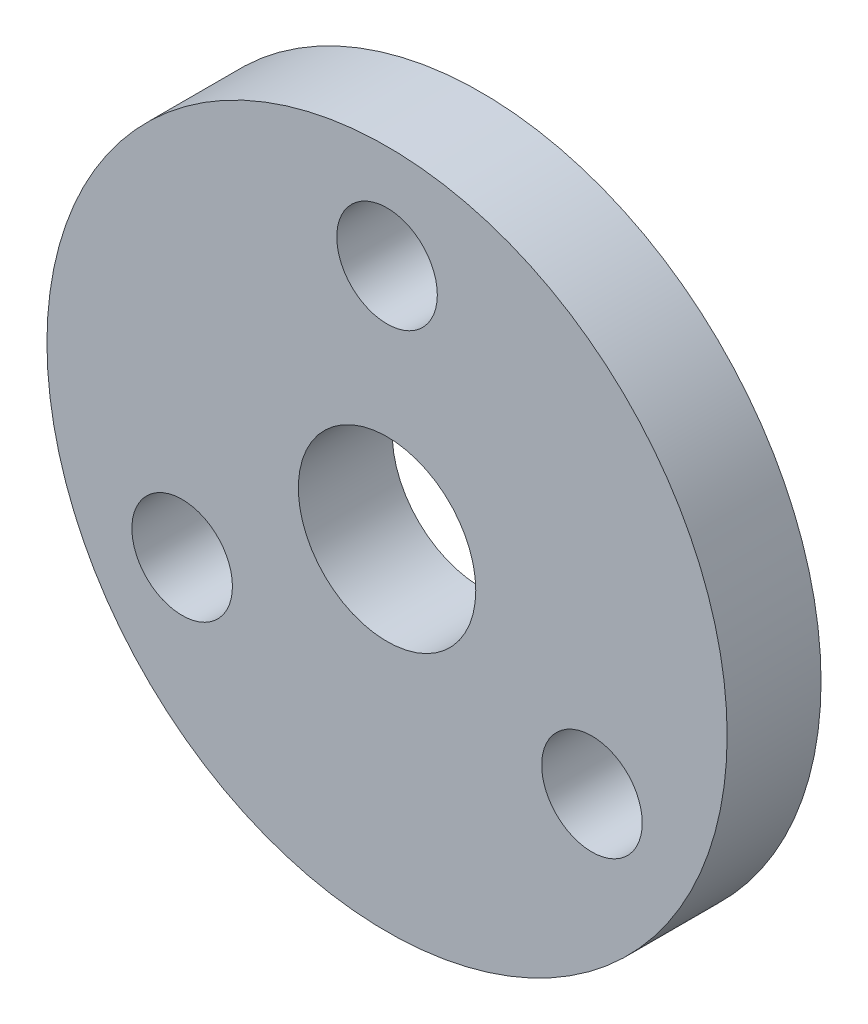
ISO-10303-21;
HEADER;
FILE_DESCRIPTION(('STEP AP214'),'2;1');
FILE_NAME('part.step','',(''),(''),'','','');
FILE_SCHEMA(('AUTOMOTIVE_DESIGN { 1 0 10303 214 1 1 1 1 }'));
ENDSEC;
DATA;
#1=APPLICATION_CONTEXT('core data for automotive mechanical design processes');
#2=APPLICATION_PROTOCOL_DEFINITION('international standard','automotive_design',2000,#1);
#3=PRODUCT_CONTEXT('',#1,'mechanical');
#4=PRODUCT('Part','Part','',(#3));
#5=PRODUCT_RELATED_PRODUCT_CATEGORY('part','',(#4));
#6=PRODUCT_DEFINITION_FORMATION('','',#4);
#7=PRODUCT_DEFINITION_CONTEXT('part definition',#1,'design');
#8=PRODUCT_DEFINITION('design','',#6,#7);
#9=PRODUCT_DEFINITION_SHAPE('','',#8);
#10=(LENGTH_UNIT() NAMED_UNIT(*) SI_UNIT(.MILLI.,.METRE.));
#11=(NAMED_UNIT(*) PLANE_ANGLE_UNIT() SI_UNIT($,.RADIAN.));
#12=(NAMED_UNIT(*) SI_UNIT($,.STERADIAN.) SOLID_ANGLE_UNIT());
#13=UNCERTAINTY_MEASURE_WITH_UNIT(LENGTH_MEASURE(1.E-05),#10,'distance_accuracy_value','');
#14=(GEOMETRIC_REPRESENTATION_CONTEXT(3) GLOBAL_UNCERTAINTY_ASSIGNED_CONTEXT((#13)) GLOBAL_UNIT_ASSIGNED_CONTEXT((#10,
#11,#12)) REPRESENTATION_CONTEXT('',''));
#15=CARTESIAN_POINT('',(0.,0.,0.));
#16=DIRECTION('',(0.,0.,1.));
#17=DIRECTION('',(1.,0.,0.));
#18=AXIS2_PLACEMENT_3D('',#15,#16,#17);
#19=CARTESIAN_POINT('',(10.1036297108185,-10.1100587120953,3.175));
#20=DIRECTION('',(0.,0.,1.));
#21=DIRECTION('',(1.,0.,0.));
#22=AXIS2_PLACEMENT_3D('',#19,#20,#21);
#23=PLANE('',#22);
#24=CARTESIAN_POINT('',(10.1036297108185,-2.11005871209532,3.175));
#25=DIRECTION('',(0.,0.,1.));
#26=DIRECTION('',(1.,0.,0.));
#27=AXIS2_PLACEMENT_3D('',#24,#25,#26);
#28=CIRCLE('',#27,1.7);
#29=CARTESIAN_POINT('',(11.8036297108185,-2.11005871209532,3.175));
#30=VERTEX_POINT('',#29);
#31=EDGE_CURVE('E52',#30,#30,#28,.T.);
#32=ORIENTED_EDGE('',*,*,#31,.F.);
#33=EDGE_LOOP('',(#32));
#34=FACE_BOUND('',#33,.T.);
#35=CARTESIAN_POINT('',(3.17542648054291,-14.1100587120953,3.175));
#36=DIRECTION('',(0.,0.,1.));
#37=DIRECTION('',(1.,0.,0.));
#38=AXIS2_PLACEMENT_3D('',#35,#36,#37);
#39=CIRCLE('',#38,1.7);
#40=CARTESIAN_POINT('',(4.87542648054291,-14.1100587120953,3.175));
#41=VERTEX_POINT('',#40);
#42=EDGE_CURVE('E41',#41,#41,#39,.T.);
#43=ORIENTED_EDGE('',*,*,#42,.F.);
#44=EDGE_LOOP('',(#43));
#45=FACE_BOUND('',#44,.T.);
#46=CARTESIAN_POINT('',(10.1036297108185,-10.1100587120953,3.175));
#47=DIRECTION('',(0.,0.,1.));
#48=DIRECTION('',(1.,0.,0.));
#49=AXIS2_PLACEMENT_3D('',#46,#47,#48);
#50=CIRCLE('',#49,11.5);
#51=CARTESIAN_POINT('',(21.6036297108185,-10.1100587120953,3.175));
#52=VERTEX_POINT('',#51);
#53=EDGE_CURVE('E10',#52,#52,#50,.T.);
#54=ORIENTED_EDGE('',*,*,#53,.T.);
#55=EDGE_LOOP('',(#54));
#56=FACE_BOUND('',#55,.T.);
#57=CARTESIAN_POINT('',(17.0318329410939,-14.1100587120954,3.175));
#58=DIRECTION('',(0.,0.,1.));
#59=DIRECTION('',(1.,0.,0.));
#60=AXIS2_PLACEMENT_3D('',#57,#58,#59);
#61=CIRCLE('',#60,1.7);
#62=CARTESIAN_POINT('',(18.7318329410939,-14.1100587120954,3.175));
#63=VERTEX_POINT('',#62);
#64=EDGE_CURVE('E46',#63,#63,#61,.T.);
#65=ORIENTED_EDGE('',*,*,#64,.F.);
#66=EDGE_LOOP('',(#65));
#67=FACE_BOUND('',#66,.T.);
#68=CARTESIAN_POINT('',(10.1036297108185,-10.1100587120953,3.175));
#69=DIRECTION('',(0.,0.,1.));
#70=DIRECTION('',(1.,0.,0.));
#71=AXIS2_PLACEMENT_3D('',#68,#69,#70);
#72=CIRCLE('',#71,3.);
#73=CARTESIAN_POINT('',(13.1036297108185,-10.1100587120953,3.175));
#74=VERTEX_POINT('',#73);
#75=EDGE_CURVE('E58',#74,#74,#72,.T.);
#76=ORIENTED_EDGE('',*,*,#75,.F.);
#77=EDGE_LOOP('',(#76));
#78=FACE_BOUND('',#77,.T.);
#79=ADVANCED_FACE('F30',(#34,#45,#56,#67,#78),#23,.T.);
#80=CARTESIAN_POINT('',(10.1036297108185,-10.1100587120953,0.));
#81=DIRECTION('',(0.,0.,1.));
#82=DIRECTION('',(1.,0.,0.));
#83=AXIS2_PLACEMENT_3D('',#80,#81,#82);
#84=PLANE('',#83);
#85=CARTESIAN_POINT('',(10.1036297108185,-10.1100587120953,0.));
#86=DIRECTION('',(0.,0.,1.));
#87=DIRECTION('',(1.,0.,0.));
#88=AXIS2_PLACEMENT_3D('',#85,#86,#87);
#89=CIRCLE('',#88,11.5);
#90=CARTESIAN_POINT('',(21.6036297108185,-10.1100587120953,0.));
#91=VERTEX_POINT('',#90);
#92=EDGE_CURVE('E34',#91,#91,#89,.T.);
#93=ORIENTED_EDGE('',*,*,#92,.F.);
#94=EDGE_LOOP('',(#93));
#95=FACE_BOUND('',#94,.T.);
#96=CARTESIAN_POINT('',(3.17542648054291,-14.1100587120953,0.));
#97=DIRECTION('',(0.,0.,1.));
#98=DIRECTION('',(1.,0.,0.));
#99=AXIS2_PLACEMENT_3D('',#96,#97,#98);
#100=CIRCLE('',#99,1.7);
#101=CARTESIAN_POINT('',(4.87542648054291,-14.1100587120953,0.));
#102=VERTEX_POINT('',#101);
#103=EDGE_CURVE('E43',#102,#102,#100,.T.);
#104=ORIENTED_EDGE('',*,*,#103,.T.);
#105=EDGE_LOOP('',(#104));
#106=FACE_BOUND('',#105,.T.);
#107=CARTESIAN_POINT('',(17.0318329410939,-14.1100587120954,0.));
#108=DIRECTION('',(0.,0.,1.));
#109=DIRECTION('',(1.,0.,0.));
#110=AXIS2_PLACEMENT_3D('',#107,#108,#109);
#111=CIRCLE('',#110,1.7);
#112=CARTESIAN_POINT('',(18.7318329410939,-14.1100587120954,0.));
#113=VERTEX_POINT('',#112);
#114=EDGE_CURVE('E49',#113,#113,#111,.T.);
#115=ORIENTED_EDGE('',*,*,#114,.T.);
#116=EDGE_LOOP('',(#115));
#117=FACE_BOUND('',#116,.T.);
#118=CARTESIAN_POINT('',(10.1036297108185,-2.11005871209532,0.));
#119=DIRECTION('',(0.,0.,1.));
#120=DIRECTION('',(1.,0.,0.));
#121=AXIS2_PLACEMENT_3D('',#118,#119,#120);
#122=CIRCLE('',#121,1.7);
#123=CARTESIAN_POINT('',(11.8036297108185,-2.11005871209532,0.));
#124=VERTEX_POINT('',#123);
#125=EDGE_CURVE('E55',#124,#124,#122,.T.);
#126=ORIENTED_EDGE('',*,*,#125,.T.);
#127=EDGE_LOOP('',(#126));
#128=FACE_BOUND('',#127,.T.);
#129=CARTESIAN_POINT('',(10.1036297108185,-10.1100587120953,0.));
#130=DIRECTION('',(0.,0.,1.));
#131=DIRECTION('',(1.,0.,0.));
#132=AXIS2_PLACEMENT_3D('',#129,#130,#131);
#133=CIRCLE('',#132,3.);
#134=CARTESIAN_POINT('',(13.1036297108185,-10.1100587120953,0.));
#135=VERTEX_POINT('',#134);
#136=EDGE_CURVE('E61',#135,#135,#133,.T.);
#137=ORIENTED_EDGE('',*,*,#136,.T.);
#138=EDGE_LOOP('',(#137));
#139=FACE_BOUND('',#138,.T.);
#140=ADVANCED_FACE('F71',(#95,#106,#117,#128,#139),#84,.F.);
#141=CARTESIAN_POINT('',(10.1036297108185,-10.1100587120953,3.175));
#142=DIRECTION('',(0.,0.,-1.));
#143=DIRECTION('',(-1.,0.,0.));
#144=AXIS2_PLACEMENT_3D('',#141,#142,#143);
#145=CYLINDRICAL_SURFACE('',#144,11.5);
#146=ORIENTED_EDGE('',*,*,#53,.F.);
#147=EDGE_LOOP('',(#146));
#148=FACE_BOUND('',#147,.T.);
#149=ORIENTED_EDGE('',*,*,#92,.T.);
#150=EDGE_LOOP('',(#149));
#151=FACE_BOUND('',#150,.T.);
#152=ADVANCED_FACE('F32',(#148,#151),#145,.T.);
#153=CARTESIAN_POINT('',(3.17542648054291,-14.1100587120953,3.175));
#154=DIRECTION('',(0.,0.,-1.));
#155=DIRECTION('',(-1.,0.,0.));
#156=AXIS2_PLACEMENT_3D('',#153,#154,#155);
#157=CYLINDRICAL_SURFACE('',#156,1.7);
#158=ORIENTED_EDGE('',*,*,#42,.T.);
#159=EDGE_LOOP('',(#158));
#160=FACE_BOUND('',#159,.T.);
#161=ORIENTED_EDGE('',*,*,#103,.F.);
#162=EDGE_LOOP('',(#161));
#163=FACE_BOUND('',#162,.T.);
#164=ADVANCED_FACE('F81',(#160,#163),#157,.F.);
#165=CARTESIAN_POINT('',(17.0318329410939,-14.1100587120954,3.175));
#166=DIRECTION('',(0.,0.,-1.));
#167=DIRECTION('',(-1.,0.,0.));
#168=AXIS2_PLACEMENT_3D('',#165,#166,#167);
#169=CYLINDRICAL_SURFACE('',#168,1.7);
#170=ORIENTED_EDGE('',*,*,#64,.T.);
#171=EDGE_LOOP('',(#170));
#172=FACE_BOUND('',#171,.T.);
#173=ORIENTED_EDGE('',*,*,#114,.F.);
#174=EDGE_LOOP('',(#173));
#175=FACE_BOUND('',#174,.T.);
#176=ADVANCED_FACE('F84',(#172,#175),#169,.F.);
#177=CARTESIAN_POINT('',(10.1036297108185,-2.11005871209532,3.175));
#178=DIRECTION('',(0.,0.,-1.));
#179=DIRECTION('',(-1.,0.,0.));
#180=AXIS2_PLACEMENT_3D('',#177,#178,#179);
#181=CYLINDRICAL_SURFACE('',#180,1.7);
#182=ORIENTED_EDGE('',*,*,#31,.T.);
#183=EDGE_LOOP('',(#182));
#184=FACE_BOUND('',#183,.T.);
#185=ORIENTED_EDGE('',*,*,#125,.F.);
#186=EDGE_LOOP('',(#185));
#187=FACE_BOUND('',#186,.T.);
#188=ADVANCED_FACE('F88',(#184,#187),#181,.F.);
#189=CARTESIAN_POINT('',(10.1036297108185,-10.1100587120953,3.175));
#190=DIRECTION('',(0.,0.,-1.));
#191=DIRECTION('',(-1.,0.,0.));
#192=AXIS2_PLACEMENT_3D('',#189,#190,#191);
#193=CYLINDRICAL_SURFACE('',#192,3.);
#194=ORIENTED_EDGE('',*,*,#75,.T.);
#195=EDGE_LOOP('',(#194));
#196=FACE_BOUND('',#195,.T.);
#197=ORIENTED_EDGE('',*,*,#136,.F.);
#198=EDGE_LOOP('',(#197));
#199=FACE_BOUND('',#198,.T.);
#200=ADVANCED_FACE('F67',(#196,#199),#193,.F.);
#201=CLOSED_SHELL('',(#79,#140,#152,#164,#176,#188,#200));
#202=MANIFOLD_SOLID_BREP('B2',#201);
#203=ADVANCED_BREP_SHAPE_REPRESENTATION('',(#18,#202),#14);
#204=SHAPE_DEFINITION_REPRESENTATION(#9,#203);
ENDSEC;
END-ISO-10303-21;
